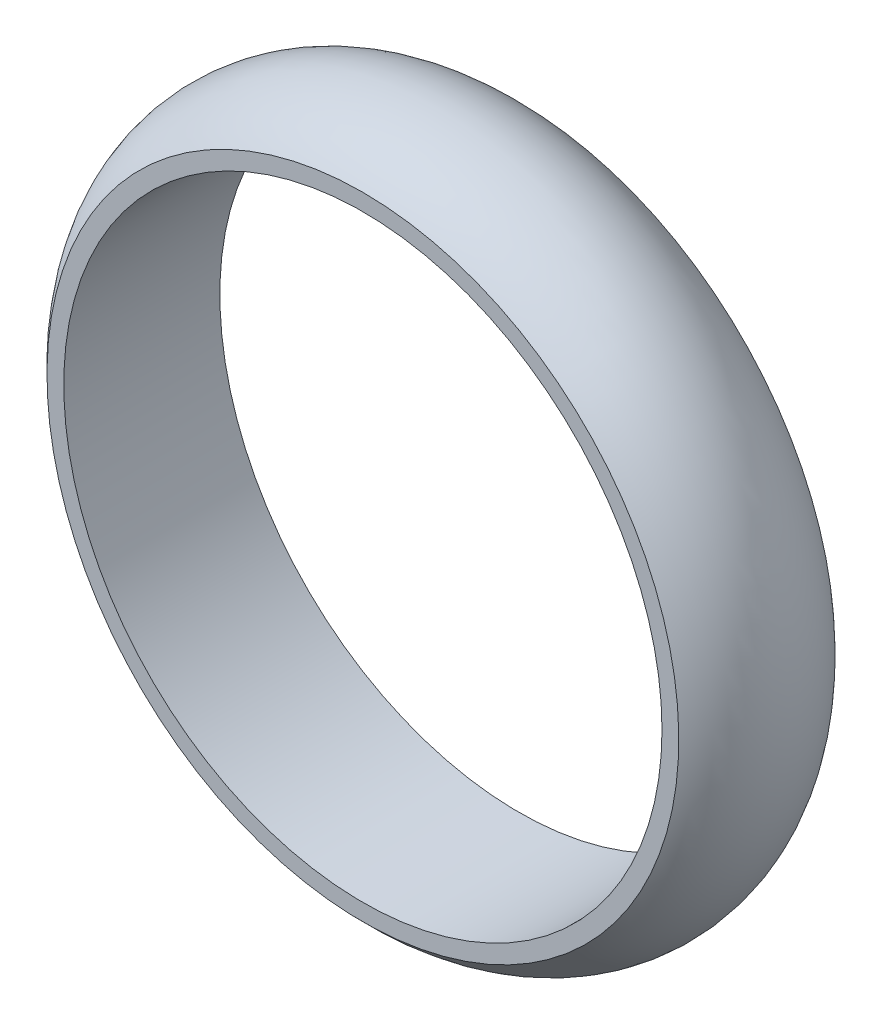
ISO-10303-21;
HEADER;
FILE_DESCRIPTION(('STEP AP214'),'2;1');
FILE_NAME('part.step','',(''),(''),'','','');
FILE_SCHEMA(('AUTOMOTIVE_DESIGN { 1 0 10303 214 1 1 1 1 }'));
ENDSEC;
DATA;
#1=APPLICATION_CONTEXT('core data for automotive mechanical design processes');
#2=APPLICATION_PROTOCOL_DEFINITION('international standard','automotive_design',2000,#1);
#3=PRODUCT_CONTEXT('',#1,'mechanical');
#4=PRODUCT('Part','Part','',(#3));
#5=PRODUCT_RELATED_PRODUCT_CATEGORY('part','',(#4));
#6=PRODUCT_DEFINITION_FORMATION('','',#4);
#7=PRODUCT_DEFINITION_CONTEXT('part definition',#1,'design');
#8=PRODUCT_DEFINITION('design','',#6,#7);
#9=PRODUCT_DEFINITION_SHAPE('','',#8);
#10=(LENGTH_UNIT() NAMED_UNIT(*) SI_UNIT(.MILLI.,.METRE.));
#11=(NAMED_UNIT(*) PLANE_ANGLE_UNIT() SI_UNIT($,.RADIAN.));
#12=(NAMED_UNIT(*) SI_UNIT($,.STERADIAN.) SOLID_ANGLE_UNIT());
#13=UNCERTAINTY_MEASURE_WITH_UNIT(LENGTH_MEASURE(1.E-05),#10,'distance_accuracy_value','');
#14=(GEOMETRIC_REPRESENTATION_CONTEXT(3) GLOBAL_UNCERTAINTY_ASSIGNED_CONTEXT((#13)) GLOBAL_UNIT_ASSIGNED_CONTEXT((#10,
#11,#12)) REPRESENTATION_CONTEXT('',''));
#15=CARTESIAN_POINT('',(0.,0.,0.));
#16=DIRECTION('',(0.,0.,1.));
#17=DIRECTION('',(1.,0.,0.));
#18=AXIS2_PLACEMENT_3D('',#15,#16,#17);
#19=CARTESIAN_POINT('',(0.,0.,0.));
#20=DIRECTION('',(0.,0.,1.));
#21=DIRECTION('',(1.,0.,0.));
#22=AXIS2_PLACEMENT_3D('',#19,#20,#21);
#23=PLANE('',#22);
#24=CARTESIAN_POINT('',(0.,0.,0.));
#25=DIRECTION('',(0.,0.,1.));
#26=DIRECTION('',(1.,0.,0.));
#27=AXIS2_PLACEMENT_3D('',#24,#25,#26);
#28=CIRCLE('',#27,57.5);
#29=CARTESIAN_POINT('',(57.5,0.,0.));
#30=VERTEX_POINT('',#29);
#31=EDGE_CURVE('E35',#30,#30,#28,.T.);
#32=ORIENTED_EDGE('',*,*,#31,.T.);
#33=EDGE_LOOP('',(#32));
#34=FACE_BOUND('',#33,.T.);
#35=CARTESIAN_POINT('',(0.,0.,-2.60085095539501E-13));
#36=DIRECTION('',(0.,0.,-1.));
#37=DIRECTION('',(0.,1.,0.));
#38=AXIS2_PLACEMENT_3D('',#35,#36,#37);
#39=CIRCLE('',#38,60.728756555323);
#40=CARTESIAN_POINT('',(0.,60.728756555323,-2.4892940393975E-13));
#41=VERTEX_POINT('',#40);
#42=EDGE_CURVE('E46',#41,#41,#39,.T.);
#43=ORIENTED_EDGE('',*,*,#42,.T.);
#44=EDGE_LOOP('',(#43));
#45=FACE_BOUND('',#44,.T.);
#46=ADVANCED_FACE('F32',(#34,#45),#23,.F.);
#47=CARTESIAN_POINT('',(0.,0.,30.));
#48=DIRECTION('',(0.,0.,1.));
#49=DIRECTION('',(1.,0.,0.));
#50=AXIS2_PLACEMENT_3D('',#47,#48,#49);
#51=PLANE('',#50);
#52=CARTESIAN_POINT('',(0.,0.,30.));
#53=DIRECTION('',(0.,0.,-1.));
#54=DIRECTION('',(0.,1.,0.));
#55=AXIS2_PLACEMENT_3D('',#52,#53,#54);
#56=CIRCLE('',#55,60.728756555323);
#57=CARTESIAN_POINT('',(0.,60.728756555323,30.));
#58=VERTEX_POINT('',#57);
#59=EDGE_CURVE('E42',#58,#58,#56,.T.);
#60=ORIENTED_EDGE('',*,*,#59,.F.);
#61=EDGE_LOOP('',(#60));
#62=FACE_BOUND('',#61,.T.);
#63=CARTESIAN_POINT('',(0.,0.,30.));
#64=DIRECTION('',(0.,0.,1.));
#65=DIRECTION('',(1.,0.,0.));
#66=AXIS2_PLACEMENT_3D('',#63,#64,#65);
#67=CIRCLE('',#66,57.5);
#68=CARTESIAN_POINT('',(57.5,0.,30.));
#69=VERTEX_POINT('',#68);
#70=EDGE_CURVE('E10',#69,#69,#67,.T.);
#71=ORIENTED_EDGE('',*,*,#70,.F.);
#72=EDGE_LOOP('',(#71));
#73=FACE_BOUND('',#72,.T.);
#74=ADVANCED_FACE('F59',(#62,#73),#51,.T.);
#75=CARTESIAN_POINT('',(0.,0.,30.));
#76=DIRECTION('',(0.,0.,-1.));
#77=DIRECTION('',(-1.,0.,0.));
#78=AXIS2_PLACEMENT_3D('',#75,#76,#77);
#79=CYLINDRICAL_SURFACE('',#78,57.5);
#80=ORIENTED_EDGE('',*,*,#70,.T.);
#81=EDGE_LOOP('',(#80));
#82=FACE_BOUND('',#81,.T.);
#83=ORIENTED_EDGE('',*,*,#31,.F.);
#84=EDGE_LOOP('',(#83));
#85=FACE_BOUND('',#84,.T.);
#86=ADVANCED_FACE('F53',(#82,#85),#79,.F.);
#87=CARTESIAN_POINT('',(0.,0.,15.));
#88=DIRECTION('',(0.,0.,-1.));
#89=DIRECTION('',(0.,1.,0.));
#90=AXIS2_PLACEMENT_3D('',#87,#88,#89);
#91=TOROIDAL_SURFACE('',#90,47.5,20.);
#92=ORIENTED_EDGE('',*,*,#59,.T.);
#93=EDGE_LOOP('',(#92));
#94=FACE_BOUND('',#93,.T.);
#95=ORIENTED_EDGE('',*,*,#42,.F.);
#96=EDGE_LOOP('',(#95));
#97=FACE_BOUND('',#96,.T.);
#98=ADVANCED_FACE('F51',(#94,#97),#91,.T.);
#99=CLOSED_SHELL('',(#46,#74,#86,#98));
#100=MANIFOLD_SOLID_BREP('B2',#99);
#101=ADVANCED_BREP_SHAPE_REPRESENTATION('',(#18,#100),#14);
#102=SHAPE_DEFINITION_REPRESENTATION(#9,#101);
ENDSEC;
END-ISO-10303-21;
